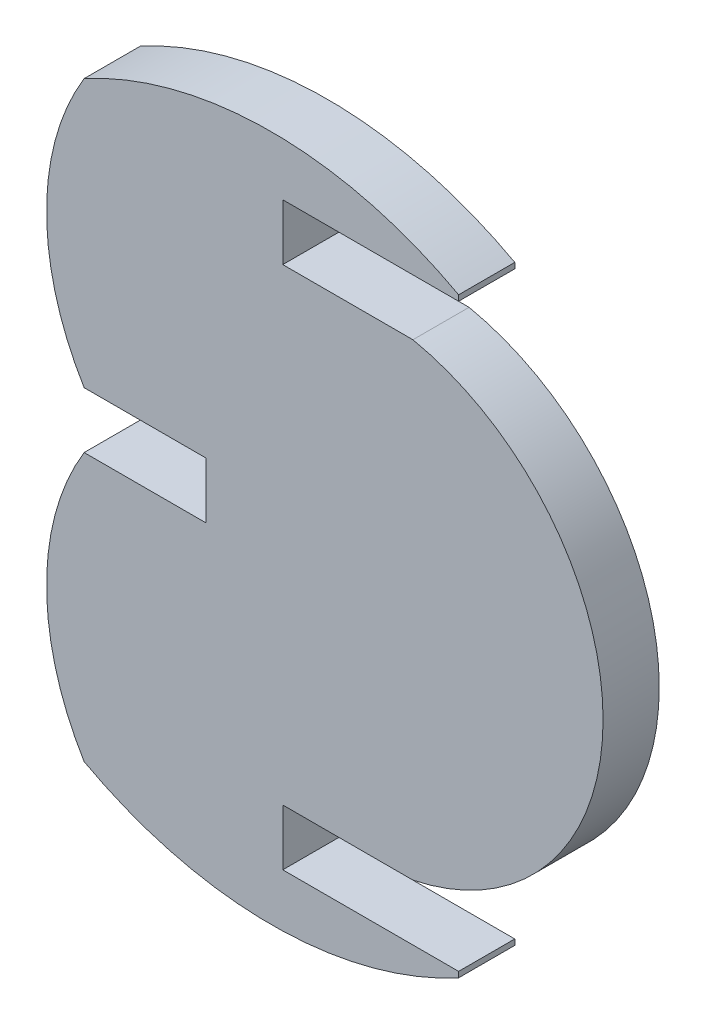
ISO-10303-21;
HEADER;
FILE_DESCRIPTION(('STEP AP214'),'2;1');
FILE_NAME('part.step','',(''),(''),'','','');
FILE_SCHEMA(('AUTOMOTIVE_DESIGN { 1 0 10303 214 1 1 1 1 }'));
ENDSEC;
DATA;
#1=APPLICATION_CONTEXT('core data for automotive mechanical design processes');
#2=APPLICATION_PROTOCOL_DEFINITION('international standard','automotive_design',2000,#1);
#3=PRODUCT_CONTEXT('',#1,'mechanical');
#4=PRODUCT('Part','Part','',(#3));
#5=PRODUCT_RELATED_PRODUCT_CATEGORY('part','',(#4));
#6=PRODUCT_DEFINITION_FORMATION('','',#4);
#7=PRODUCT_DEFINITION_CONTEXT('part definition',#1,'design');
#8=PRODUCT_DEFINITION('design','',#6,#7);
#9=PRODUCT_DEFINITION_SHAPE('','',#8);
#10=(LENGTH_UNIT() NAMED_UNIT(*) SI_UNIT(.MILLI.,.METRE.));
#11=(NAMED_UNIT(*) PLANE_ANGLE_UNIT() SI_UNIT($,.RADIAN.));
#12=(NAMED_UNIT(*) SI_UNIT($,.STERADIAN.) SOLID_ANGLE_UNIT());
#13=UNCERTAINTY_MEASURE_WITH_UNIT(LENGTH_MEASURE(1.E-05),#10,'distance_accuracy_value','');
#14=(GEOMETRIC_REPRESENTATION_CONTEXT(3) GLOBAL_UNCERTAINTY_ASSIGNED_CONTEXT((#13)) GLOBAL_UNIT_ASSIGNED_CONTEXT((#10,
#11,#12)) REPRESENTATION_CONTEXT('',''));
#15=CARTESIAN_POINT('',(0.,0.,0.));
#16=DIRECTION('',(0.,0.,1.));
#17=DIRECTION('',(1.,0.,0.));
#18=AXIS2_PLACEMENT_3D('',#15,#16,#17);
#19=CARTESIAN_POINT('',(-1351.67444337138,32.5978774634032,3.));
#20=DIRECTION('',(0.,0.,-1.));
#21=DIRECTION('',(-1.,0.,0.));
#22=AXIS2_PLACEMENT_3D('',#19,#20,#21);
#23=CYLINDRICAL_SURFACE('',#22,20.9391524518943);
#24=CARTESIAN_POINT('',(-1351.67444337138,32.5978774634033,0.));
#25=DIRECTION('',(0.,0.,1.));
#26=DIRECTION('',(-1.,0.,0.));
#27=AXIS2_PLACEMENT_3D('',#24,#25,#26);
#28=CIRCLE('',#27,20.9391524518943);
#29=CARTESIAN_POINT('',(-1341.67214431126,50.993586716262,0.));
#30=VERTEX_POINT('',#29);
#31=CARTESIAN_POINT('',(-1361.67674243149,50.9935867162619,1.11022302462516E-13));
#32=VERTEX_POINT('',#31);
#33=EDGE_CURVE('E148',#30,#32,#28,.T.);
#34=ORIENTED_EDGE('',*,*,#33,.T.);
#35=DIRECTION('',(0.,0.,-1.));
#36=VECTOR('',#35,1.);
#37=CARTESIAN_POINT('',(-1361.67674243149,50.9935867162619,3.00000000000003));
#38=LINE('',#37,#36);
#39=CARTESIAN_POINT('',(-1361.67674243149,50.9935867162619,3.00000000000003));
#40=VERTEX_POINT('',#39);
#41=EDGE_CURVE('E11',#40,#32,#38,.T.);
#42=ORIENTED_EDGE('',*,*,#41,.F.);
#43=CARTESIAN_POINT('',(-1351.67444337138,32.5978774634032,3.));
#44=DIRECTION('',(0.,0.,1.));
#45=DIRECTION('',(-1.,0.,0.));
#46=AXIS2_PLACEMENT_3D('',#43,#44,#45);
#47=CIRCLE('',#46,20.9391524518943);
#48=CARTESIAN_POINT('',(-1341.67214431126,50.9935867162618,2.99999999999989));
#49=VERTEX_POINT('',#48);
#50=EDGE_CURVE('E191',#49,#40,#47,.T.);
#51=ORIENTED_EDGE('',*,*,#50,.F.);
#52=DIRECTION('',(0.,0.,-1.));
#53=VECTOR('',#52,1.);
#54=CARTESIAN_POINT('',(-1341.67214431126,50.9935867162618,2.99999999999989));
#55=LINE('',#54,#53);
#56=EDGE_CURVE('E161',#49,#30,#55,.T.);
#57=ORIENTED_EDGE('',*,*,#56,.T.);
#58=EDGE_LOOP('',(#34,#42,#51,#57));
#59=FACE_BOUND('',#58,.T.);
#60=ADVANCED_FACE('F32',(#59),#23,.T.);
#61=CARTESIAN_POINT('',(-1349.93719267488,43.8432149049641,3.00000000000017));
#62=DIRECTION('',(0.,0.,-1.));
#63=DIRECTION('',(-1.,0.,0.));
#64=AXIS2_PLACEMENT_3D('',#61,#62,#63);
#65=CYLINDRICAL_SURFACE('',#64,13.7457209897385);
#66=CARTESIAN_POINT('',(-1349.93719267488,43.8432149049641,1.66533453693773E-13));
#67=DIRECTION('',(0.,0.,1.));
#68=DIRECTION('',(1.,0.,0.));
#69=AXIS2_PLACEMENT_3D('',#66,#67,#68);
#70=CIRCLE('',#69,13.7457209897385);
#71=CARTESIAN_POINT('',(-1361.67674243149,36.6928430936662,0.));
#72=VERTEX_POINT('',#71);
#73=EDGE_CURVE('E144',#32,#72,#70,.T.);
#74=ORIENTED_EDGE('',*,*,#73,.T.);
#75=DIRECTION('',(0.,0.,-1.));
#76=VECTOR('',#75,1.);
#77=CARTESIAN_POINT('',(-1361.67674243149,36.6928430936663,3.00000000000006));
#78=LINE('',#77,#76);
#79=CARTESIAN_POINT('',(-1361.67674243149,36.6928430936663,3.00000000000006));
#80=VERTEX_POINT('',#79);
#81=EDGE_CURVE('E39',#80,#72,#78,.T.);
#82=ORIENTED_EDGE('',*,*,#81,.F.);
#83=CARTESIAN_POINT('',(-1349.93719267488,43.8432149049641,3.00000000000017));
#84=DIRECTION('',(0.,0.,1.));
#85=DIRECTION('',(1.,0.,0.));
#86=AXIS2_PLACEMENT_3D('',#83,#84,#85);
#87=CIRCLE('',#86,13.7457209897385);
#88=EDGE_CURVE('E157',#40,#80,#87,.T.);
#89=ORIENTED_EDGE('',*,*,#88,.F.);
#90=ORIENTED_EDGE('',*,*,#41,.T.);
#91=EDGE_LOOP('',(#74,#82,#89,#90));
#92=FACE_BOUND('',#91,.T.);
#93=ADVANCED_FACE('F156',(#92),#65,.T.);
#94=CARTESIAN_POINT('',(-1361.67674243149,36.6928430936663,3.00000000000006));
#95=DIRECTION('',(0.,1.,0.));
#96=DIRECTION('',(-1.,0.,0.));
#97=AXIS2_PLACEMENT_3D('',#94,#95,#96);
#98=PLANE('',#97);
#99=DIRECTION('',(1.,0.,0.));
#100=VECTOR('',#99,1.);
#101=CARTESIAN_POINT('',(-1361.67674243149,36.6928430936662,0.));
#102=LINE('',#101,#100);
#103=CARTESIAN_POINT('',(-1355.15711139407,36.6928430936663,0.));
#104=VERTEX_POINT('',#103);
#105=EDGE_CURVE('E150',#72,#104,#102,.T.);
#106=ORIENTED_EDGE('',*,*,#105,.T.);
#107=DIRECTION('',(0.,0.,-1.));
#108=VECTOR('',#107,1.);
#109=CARTESIAN_POINT('',(-1355.15711139407,36.6928430936664,3.00000000000003));
#110=LINE('',#109,#108);
#111=CARTESIAN_POINT('',(-1355.15711139407,36.6928430936664,3.00000000000003));
#112=VERTEX_POINT('',#111);
#113=EDGE_CURVE('E257',#112,#104,#110,.T.);
#114=ORIENTED_EDGE('',*,*,#113,.F.);
#115=DIRECTION('',(1.,0.,0.));
#116=VECTOR('',#115,1.);
#117=CARTESIAN_POINT('',(-1361.67674243149,36.6928430936663,3.00000000000006));
#118=LINE('',#117,#116);
#119=EDGE_CURVE('E194',#80,#112,#118,.T.);
#120=ORIENTED_EDGE('',*,*,#119,.F.);
#121=ORIENTED_EDGE('',*,*,#81,.T.);
#122=EDGE_LOOP('',(#106,#114,#120,#121));
#123=FACE_BOUND('',#122,.T.);
#124=ADVANCED_FACE('F261',(#123),#98,.F.);
#125=CARTESIAN_POINT('',(-1355.15711139407,33.6928430936663,2.99999999999998));
#126=DIRECTION('',(1.,0.,0.));
#127=DIRECTION('',(0.,0.,-1.));
#128=AXIS2_PLACEMENT_3D('',#125,#126,#127);
#129=PLANE('',#128);
#130=DIRECTION('',(0.,-1.,0.));
#131=VECTOR('',#130,1.);
#132=CARTESIAN_POINT('',(-1355.15711139407,33.6928430936663,0.));
#133=LINE('',#132,#131);
#134=CARTESIAN_POINT('',(-1355.15711139407,33.6928430936663,0.));
#135=VERTEX_POINT('',#134);
#136=EDGE_CURVE('E165',#104,#135,#133,.T.);
#137=ORIENTED_EDGE('',*,*,#136,.T.);
#138=DIRECTION('',(0.,0.,-1.));
#139=VECTOR('',#138,1.);
#140=CARTESIAN_POINT('',(-1355.15711139407,33.6928430936663,2.99999999999998));
#141=LINE('',#140,#139);
#142=CARTESIAN_POINT('',(-1355.15711139407,33.6928430936663,2.99999999999998));
#143=VERTEX_POINT('',#142);
#144=EDGE_CURVE('E254',#143,#135,#141,.T.);
#145=ORIENTED_EDGE('',*,*,#144,.F.);
#146=DIRECTION('',(0.,-1.,0.));
#147=VECTOR('',#146,1.);
#148=CARTESIAN_POINT('',(-1355.15711139407,33.6928430936663,2.99999999999998));
#149=LINE('',#148,#147);
#150=EDGE_CURVE('E196',#112,#143,#149,.T.);
#151=ORIENTED_EDGE('',*,*,#150,.F.);
#152=ORIENTED_EDGE('',*,*,#113,.T.);
#153=EDGE_LOOP('',(#137,#145,#151,#152));
#154=FACE_BOUND('',#153,.T.);
#155=ADVANCED_FACE('F269',(#154),#129,.F.);
#156=CARTESIAN_POINT('',(-1361.67674243149,33.6928430936663,3.00000000000003));
#157=DIRECTION('',(0.,-1.,0.));
#158=DIRECTION('',(1.,0.,0.));
#159=AXIS2_PLACEMENT_3D('',#156,#157,#158);
#160=PLANE('',#159);
#161=DIRECTION('',(-1.,0.,0.));
#162=VECTOR('',#161,1.);
#163=CARTESIAN_POINT('',(-1361.67674243149,33.6928430936663,0.));
#164=LINE('',#163,#162);
#165=CARTESIAN_POINT('',(-1361.67674243149,33.6928430936663,0.));
#166=VERTEX_POINT('',#165);
#167=EDGE_CURVE('E167',#135,#166,#164,.T.);
#168=ORIENTED_EDGE('',*,*,#167,.T.);
#169=DIRECTION('',(0.,0.,-1.));
#170=VECTOR('',#169,1.);
#171=CARTESIAN_POINT('',(-1361.67674243149,33.6928430936663,3.00000000000003));
#172=LINE('',#171,#170);
#173=CARTESIAN_POINT('',(-1361.67674243149,33.6928430936663,3.00000000000003));
#174=VERTEX_POINT('',#173);
#175=EDGE_CURVE('E251',#174,#166,#172,.T.);
#176=ORIENTED_EDGE('',*,*,#175,.F.);
#177=DIRECTION('',(-1.,0.,0.));
#178=VECTOR('',#177,1.);
#179=CARTESIAN_POINT('',(-1361.67674243149,33.6928430936663,3.00000000000003));
#180=LINE('',#179,#178);
#181=EDGE_CURVE('E198',#143,#174,#180,.T.);
#182=ORIENTED_EDGE('',*,*,#181,.F.);
#183=ORIENTED_EDGE('',*,*,#144,.T.);
#184=EDGE_LOOP('',(#168,#176,#182,#183));
#185=FACE_BOUND('',#184,.T.);
#186=ADVANCED_FACE('F272',(#185),#160,.F.);
#187=CARTESIAN_POINT('',(-1349.93719267488,26.5424712823685,2.99999999999996));
#188=DIRECTION('',(0.,0.,-1.));
#189=DIRECTION('',(-1.,0.,0.));
#190=AXIS2_PLACEMENT_3D('',#187,#188,#189);
#191=CYLINDRICAL_SURFACE('',#190,13.7457209897385);
#192=CARTESIAN_POINT('',(-1349.93719267488,26.5424712823684,0.));
#193=DIRECTION('',(0.,0.,1.));
#194=DIRECTION('',(-1.,0.,0.));
#195=AXIS2_PLACEMENT_3D('',#192,#193,#194);
#196=CIRCLE('',#195,13.7457209897385);
#197=CARTESIAN_POINT('',(-1361.67674243149,19.3920994710707,0.));
#198=VERTEX_POINT('',#197);
#199=EDGE_CURVE('E169',#166,#198,#196,.T.);
#200=ORIENTED_EDGE('',*,*,#199,.T.);
#201=DIRECTION('',(0.,0.,-1.));
#202=VECTOR('',#201,1.);
#203=CARTESIAN_POINT('',(-1361.67674243149,19.3920994710706,2.99999999999996));
#204=LINE('',#203,#202);
#205=CARTESIAN_POINT('',(-1361.67674243149,19.3920994710706,2.99999999999996));
#206=VERTEX_POINT('',#205);
#207=EDGE_CURVE('E248',#206,#198,#204,.T.);
#208=ORIENTED_EDGE('',*,*,#207,.F.);
#209=CARTESIAN_POINT('',(-1349.93719267488,26.5424712823685,2.99999999999996));
#210=DIRECTION('',(0.,0.,1.));
#211=DIRECTION('',(-1.,0.,0.));
#212=AXIS2_PLACEMENT_3D('',#209,#210,#211);
#213=CIRCLE('',#212,13.7457209897385);
#214=EDGE_CURVE('E200',#174,#206,#213,.T.);
#215=ORIENTED_EDGE('',*,*,#214,.F.);
#216=ORIENTED_EDGE('',*,*,#175,.T.);
#217=EDGE_LOOP('',(#200,#208,#215,#216));
#218=FACE_BOUND('',#217,.T.);
#219=ADVANCED_FACE('F277',(#218),#191,.T.);
#220=CARTESIAN_POINT('',(-1351.67444337138,37.7878087239291,3.00000000000013));
#221=DIRECTION('',(0.,0.,-1.));
#222=DIRECTION('',(-1.,0.,0.));
#223=AXIS2_PLACEMENT_3D('',#220,#221,#222);
#224=CYLINDRICAL_SURFACE('',#223,20.9391524518943);
#225=CARTESIAN_POINT('',(-1351.67444337138,37.7878087239291,0.));
#226=DIRECTION('',(0.,0.,1.));
#227=DIRECTION('',(1.,0.,0.));
#228=AXIS2_PLACEMENT_3D('',#225,#226,#227);
#229=CIRCLE('',#228,20.9391524518943);
#230=CARTESIAN_POINT('',(-1341.67214431126,19.3920994710709,0.));
#231=VERTEX_POINT('',#230);
#232=EDGE_CURVE('E171',#198,#231,#229,.T.);
#233=ORIENTED_EDGE('',*,*,#232,.T.);
#234=DIRECTION('',(0.,0.,-1.));
#235=VECTOR('',#234,1.);
#236=CARTESIAN_POINT('',(-1341.67214431126,19.3920994710709,3.00000000000004));
#237=LINE('',#236,#235);
#238=CARTESIAN_POINT('',(-1341.67214431126,19.3920994710709,3.00000000000004));
#239=VERTEX_POINT('',#238);
#240=EDGE_CURVE('E245',#239,#231,#237,.T.);
#241=ORIENTED_EDGE('',*,*,#240,.F.);
#242=CARTESIAN_POINT('',(-1351.67444337138,37.7878087239291,3.00000000000013));
#243=DIRECTION('',(0.,0.,1.));
#244=DIRECTION('',(1.,0.,0.));
#245=AXIS2_PLACEMENT_3D('',#242,#243,#244);
#246=CIRCLE('',#245,20.9391524518943);
#247=EDGE_CURVE('E202',#206,#239,#246,.T.);
#248=ORIENTED_EDGE('',*,*,#247,.F.);
#249=ORIENTED_EDGE('',*,*,#207,.T.);
#250=EDGE_LOOP('',(#233,#241,#248,#249));
#251=FACE_BOUND('',#250,.T.);
#252=ADVANCED_FACE('F283',(#251),#224,.T.);
#253=CARTESIAN_POINT('',(-1341.67214431126,19.3920994710709,3.00000000000004));
#254=DIRECTION('',(-1.,0.,0.));
#255=DIRECTION('',(0.,0.,1.));
#256=AXIS2_PLACEMENT_3D('',#253,#254,#255);
#257=PLANE('',#256);
#258=DIRECTION('',(0.,1.,0.));
#259=VECTOR('',#258,1.);
#260=CARTESIAN_POINT('',(-1341.67214431126,19.3920994710709,0.));
#261=LINE('',#260,#259);
#262=CARTESIAN_POINT('',(-1341.67214431126,19.6928430936664,0.));
#263=VERTEX_POINT('',#262);
#264=EDGE_CURVE('E173',#231,#263,#261,.T.);
#265=ORIENTED_EDGE('',*,*,#264,.T.);
#266=DIRECTION('',(0.,0.,-1.));
#267=VECTOR('',#266,1.);
#268=CARTESIAN_POINT('',(-1341.67214431126,19.6928430936664,2.99999999999999));
#269=LINE('',#268,#267);
#270=CARTESIAN_POINT('',(-1341.67214431126,19.6928430936664,2.99999999999999));
#271=VERTEX_POINT('',#270);
#272=EDGE_CURVE('E242',#271,#263,#269,.T.);
#273=ORIENTED_EDGE('',*,*,#272,.F.);
#274=DIRECTION('',(0.,1.,0.));
#275=VECTOR('',#274,1.);
#276=CARTESIAN_POINT('',(-1341.67214431126,19.3920994710709,3.00000000000004));
#277=LINE('',#276,#275);
#278=EDGE_CURVE('E204',#239,#271,#277,.T.);
#279=ORIENTED_EDGE('',*,*,#278,.F.);
#280=ORIENTED_EDGE('',*,*,#240,.T.);
#281=EDGE_LOOP('',(#265,#273,#279,#280));
#282=FACE_BOUND('',#281,.T.);
#283=ADVANCED_FACE('F287',(#282),#257,.F.);
#284=CARTESIAN_POINT('',(-1351.06579288135,19.6928430936662,3.00000000000009));
#285=DIRECTION('',(0.,-1.,0.));
#286=DIRECTION('',(0.,0.,-1.));
#287=AXIS2_PLACEMENT_3D('',#284,#285,#286);
#288=PLANE('',#287);
#289=DIRECTION('',(-1.,0.,0.));
#290=VECTOR('',#289,1.);
#291=CARTESIAN_POINT('',(-1351.06579288135,19.6928430936663,0.));
#292=LINE('',#291,#290);
#293=CARTESIAN_POINT('',(-1351.06579288135,19.6928430936663,0.));
#294=VERTEX_POINT('',#293);
#295=EDGE_CURVE('E175',#263,#294,#292,.T.);
#296=ORIENTED_EDGE('',*,*,#295,.T.);
#297=DIRECTION('',(0.,0.,-1.));
#298=VECTOR('',#297,1.);
#299=CARTESIAN_POINT('',(-1351.06579288135,19.6928430936662,3.00000000000009));
#300=LINE('',#299,#298);
#301=CARTESIAN_POINT('',(-1351.06579288135,19.6928430936662,3.00000000000009));
#302=VERTEX_POINT('',#301);
#303=EDGE_CURVE('E239',#302,#294,#300,.T.);
#304=ORIENTED_EDGE('',*,*,#303,.F.);
#305=DIRECTION('',(-1.,0.,0.));
#306=VECTOR('',#305,1.);
#307=CARTESIAN_POINT('',(-1351.06579288135,19.6928430936662,3.00000000000009));
#308=LINE('',#307,#306);
#309=EDGE_CURVE('E206',#271,#302,#308,.T.);
#310=ORIENTED_EDGE('',*,*,#309,.F.);
#311=ORIENTED_EDGE('',*,*,#272,.T.);
#312=EDGE_LOOP('',(#296,#304,#310,#311));
#313=FACE_BOUND('',#312,.T.);
#314=ADVANCED_FACE('F292',(#313),#288,.F.);
#315=CARTESIAN_POINT('',(-1351.06579288135,19.6928430936662,3.00000000000009));
#316=DIRECTION('',(-1.,0.,0.));
#317=DIRECTION('',(0.,0.,1.));
#318=AXIS2_PLACEMENT_3D('',#315,#316,#317);
#319=PLANE('',#318);
#320=DIRECTION('',(0.,1.,0.));
#321=VECTOR('',#320,1.);
#322=CARTESIAN_POINT('',(-1351.06579288135,19.6928430936663,0.));
#323=LINE('',#322,#321);
#324=CARTESIAN_POINT('',(-1351.06579288135,22.6928430936663,0.));
#325=VERTEX_POINT('',#324);
#326=EDGE_CURVE('E177',#294,#325,#323,.T.);
#327=ORIENTED_EDGE('',*,*,#326,.T.);
#328=DIRECTION('',(0.,0.,-1.));
#329=VECTOR('',#328,1.);
#330=CARTESIAN_POINT('',(-1351.06579288135,22.6928430936664,3.00000000000006));
#331=LINE('',#330,#329);
#332=CARTESIAN_POINT('',(-1351.06579288135,22.6928430936664,3.00000000000006));
#333=VERTEX_POINT('',#332);
#334=EDGE_CURVE('E236',#333,#325,#331,.T.);
#335=ORIENTED_EDGE('',*,*,#334,.F.);
#336=DIRECTION('',(0.,1.,0.));
#337=VECTOR('',#336,1.);
#338=CARTESIAN_POINT('',(-1351.06579288135,19.6928430936662,3.00000000000009));
#339=LINE('',#338,#337);
#340=EDGE_CURVE('E208',#302,#333,#339,.T.);
#341=ORIENTED_EDGE('',*,*,#340,.F.);
#342=ORIENTED_EDGE('',*,*,#303,.T.);
#343=EDGE_LOOP('',(#327,#335,#341,#342));
#344=FACE_BOUND('',#343,.T.);
#345=ADVANCED_FACE('F298',(#344),#319,.F.);
#346=CARTESIAN_POINT('',(-1351.06579288135,22.6928430936664,3.00000000000006));
#347=DIRECTION('',(0.,1.,0.));
#348=DIRECTION('',(0.,0.,1.));
#349=AXIS2_PLACEMENT_3D('',#346,#347,#348);
#350=PLANE('',#349);
#351=DIRECTION('',(1.,0.,0.));
#352=VECTOR('',#351,1.);
#353=CARTESIAN_POINT('',(-1351.06579288135,22.6928430936663,0.));
#354=LINE('',#353,#352);
#355=CARTESIAN_POINT('',(-1344.11344595067,22.6928430936663,0.));
#356=VERTEX_POINT('',#355);
#357=EDGE_CURVE('E179',#325,#356,#354,.T.);
#358=ORIENTED_EDGE('',*,*,#357,.T.);
#359=DIRECTION('',(0.,0.,-1.));
#360=VECTOR('',#359,1.);
#361=CARTESIAN_POINT('',(-1344.11344595067,22.6928430936664,3.0000000000002));
#362=LINE('',#361,#360);
#363=CARTESIAN_POINT('',(-1344.11344595067,22.6928430936664,3.0000000000002));
#364=VERTEX_POINT('',#363);
#365=EDGE_CURVE('E233',#364,#356,#362,.T.);
#366=ORIENTED_EDGE('',*,*,#365,.F.);
#367=DIRECTION('',(1.,0.,0.));
#368=VECTOR('',#367,1.);
#369=CARTESIAN_POINT('',(-1351.06579288135,22.6928430936664,3.00000000000006));
#370=LINE('',#369,#368);
#371=EDGE_CURVE('E210',#333,#364,#370,.T.);
#372=ORIENTED_EDGE('',*,*,#371,.F.);
#373=ORIENTED_EDGE('',*,*,#334,.T.);
#374=EDGE_LOOP('',(#358,#366,#372,#373));
#375=FACE_BOUND('',#374,.T.);
#376=ADVANCED_FACE('F302',(#375),#350,.F.);
#377=CARTESIAN_POINT('',(-1346.72424414561,35.1928430936662,3.));
#378=DIRECTION('',(0.,0.,-1.));
#379=DIRECTION('',(-1.,0.,0.));
#380=AXIS2_PLACEMENT_3D('',#377,#378,#379);
#381=CYLINDRICAL_SURFACE('',#380,12.7697402955071);
#382=CARTESIAN_POINT('',(-1346.72424414561,35.1928430936662,0.));
#383=DIRECTION('',(0.,0.,1.));
#384=DIRECTION('',(-1.,0.,0.));
#385=AXIS2_PLACEMENT_3D('',#382,#383,#384);
#386=CIRCLE('',#385,12.7697402955071);
#387=CARTESIAN_POINT('',(-1344.11344595067,47.6928430936665,2.22044604925031E-13));
#388=VERTEX_POINT('',#387);
#389=EDGE_CURVE('E181',#356,#388,#386,.T.);
#390=ORIENTED_EDGE('',*,*,#389,.T.);
#391=DIRECTION('',(0.,0.,-1.));
#392=VECTOR('',#391,1.);
#393=CARTESIAN_POINT('',(-1344.11344595067,47.6928430936662,2.99999999999985));
#394=LINE('',#393,#392);
#395=CARTESIAN_POINT('',(-1344.11344595067,47.6928430936662,2.99999999999985));
#396=VERTEX_POINT('',#395);
#397=EDGE_CURVE('E230',#396,#388,#394,.T.);
#398=ORIENTED_EDGE('',*,*,#397,.F.);
#399=CARTESIAN_POINT('',(-1346.72424414561,35.1928430936662,3.));
#400=DIRECTION('',(0.,0.,1.));
#401=DIRECTION('',(-1.,0.,0.));
#402=AXIS2_PLACEMENT_3D('',#399,#400,#401);
#403=CIRCLE('',#402,12.7697402955071);
#404=EDGE_CURVE('E212',#364,#396,#403,.T.);
#405=ORIENTED_EDGE('',*,*,#404,.F.);
#406=ORIENTED_EDGE('',*,*,#365,.T.);
#407=EDGE_LOOP('',(#390,#398,#405,#406));
#408=FACE_BOUND('',#407,.T.);
#409=ADVANCED_FACE('F307',(#408),#381,.T.);
#410=CARTESIAN_POINT('',(-1351.06579288135,47.6928430936662,2.99999999999992));
#411=DIRECTION('',(0.,-1.,0.));
#412=DIRECTION('',(0.,0.,-1.));
#413=AXIS2_PLACEMENT_3D('',#410,#411,#412);
#414=PLANE('',#413);
#415=DIRECTION('',(-1.,0.,0.));
#416=VECTOR('',#415,1.);
#417=CARTESIAN_POINT('',(-1351.06579288135,47.6928430936663,1.52655665885959E-13));
#418=LINE('',#417,#416);
#419=CARTESIAN_POINT('',(-1351.06579288135,47.6928430936663,1.52655665885959E-13));
#420=VERTEX_POINT('',#419);
#421=EDGE_CURVE('E183',#388,#420,#418,.T.);
#422=ORIENTED_EDGE('',*,*,#421,.T.);
#423=DIRECTION('',(0.,0.,-1.));
#424=VECTOR('',#423,1.);
#425=CARTESIAN_POINT('',(-1351.06579288135,47.6928430936662,2.99999999999992));
#426=LINE('',#425,#424);
#427=CARTESIAN_POINT('',(-1351.06579288135,47.6928430936662,2.99999999999992));
#428=VERTEX_POINT('',#427);
#429=EDGE_CURVE('E227',#428,#420,#426,.T.);
#430=ORIENTED_EDGE('',*,*,#429,.F.);
#431=DIRECTION('',(-1.,0.,0.));
#432=VECTOR('',#431,1.);
#433=CARTESIAN_POINT('',(-1351.06579288135,47.6928430936662,2.99999999999992));
#434=LINE('',#433,#432);
#435=EDGE_CURVE('E214',#396,#428,#434,.T.);
#436=ORIENTED_EDGE('',*,*,#435,.F.);
#437=ORIENTED_EDGE('',*,*,#397,.T.);
#438=EDGE_LOOP('',(#422,#430,#436,#437));
#439=FACE_BOUND('',#438,.T.);
#440=ADVANCED_FACE('F313',(#439),#414,.F.);
#441=CARTESIAN_POINT('',(-1351.06579288135,50.6928430936662,2.99999999999996));
#442=DIRECTION('',(-1.,0.,0.));
#443=DIRECTION('',(0.,0.,1.));
#444=AXIS2_PLACEMENT_3D('',#441,#442,#443);
#445=PLANE('',#444);
#446=DIRECTION('',(0.,1.,0.));
#447=VECTOR('',#446,1.);
#448=CARTESIAN_POINT('',(-1351.06579288135,50.6928430936662,0.));
#449=LINE('',#448,#447);
#450=CARTESIAN_POINT('',(-1351.06579288135,50.6928430936662,0.));
#451=VERTEX_POINT('',#450);
#452=EDGE_CURVE('E185',#420,#451,#449,.T.);
#453=ORIENTED_EDGE('',*,*,#452,.T.);
#454=DIRECTION('',(0.,0.,-1.));
#455=VECTOR('',#454,1.);
#456=CARTESIAN_POINT('',(-1351.06579288135,50.6928430936662,2.99999999999996));
#457=LINE('',#456,#455);
#458=CARTESIAN_POINT('',(-1351.06579288135,50.6928430936662,2.99999999999996));
#459=VERTEX_POINT('',#458);
#460=EDGE_CURVE('E224',#459,#451,#457,.T.);
#461=ORIENTED_EDGE('',*,*,#460,.F.);
#462=DIRECTION('',(0.,1.,0.));
#463=VECTOR('',#462,1.);
#464=CARTESIAN_POINT('',(-1351.06579288135,50.6928430936662,2.99999999999996));
#465=LINE('',#464,#463);
#466=EDGE_CURVE('E216',#428,#459,#465,.T.);
#467=ORIENTED_EDGE('',*,*,#466,.F.);
#468=ORIENTED_EDGE('',*,*,#429,.T.);
#469=EDGE_LOOP('',(#453,#461,#467,#468));
#470=FACE_BOUND('',#469,.T.);
#471=ADVANCED_FACE('F317',(#470),#445,.F.);
#472=CARTESIAN_POINT('',(-1351.06579288135,50.6928430936662,2.99999999999996));
#473=DIRECTION('',(0.,1.,0.));
#474=DIRECTION('',(0.,0.,1.));
#475=AXIS2_PLACEMENT_3D('',#472,#473,#474);
#476=PLANE('',#475);
#477=DIRECTION('',(1.,0.,0.));
#478=VECTOR('',#477,1.);
#479=CARTESIAN_POINT('',(-1351.06579288135,50.6928430936662,0.));
#480=LINE('',#479,#478);
#481=CARTESIAN_POINT('',(-1341.67214431126,50.6928430936662,0.));
#482=VERTEX_POINT('',#481);
#483=EDGE_CURVE('E187',#451,#482,#480,.T.);
#484=ORIENTED_EDGE('',*,*,#483,.T.);
#485=DIRECTION('',(0.,0.,-1.));
#486=VECTOR('',#485,1.);
#487=CARTESIAN_POINT('',(-1341.67214431126,50.6928430936663,2.99999999999995));
#488=LINE('',#487,#486);
#489=CARTESIAN_POINT('',(-1341.67214431126,50.6928430936663,2.99999999999995));
#490=VERTEX_POINT('',#489);
#491=EDGE_CURVE('E221',#490,#482,#488,.T.);
#492=ORIENTED_EDGE('',*,*,#491,.F.);
#493=DIRECTION('',(1.,0.,0.));
#494=VECTOR('',#493,1.);
#495=CARTESIAN_POINT('',(-1351.06579288135,50.6928430936662,2.99999999999996));
#496=LINE('',#495,#494);
#497=EDGE_CURVE('E51',#459,#490,#496,.T.);
#498=ORIENTED_EDGE('',*,*,#497,.F.);
#499=ORIENTED_EDGE('',*,*,#460,.T.);
#500=EDGE_LOOP('',(#484,#492,#498,#499));
#501=FACE_BOUND('',#500,.T.);
#502=ADVANCED_FACE('F320',(#501),#476,.F.);
#503=CARTESIAN_POINT('',(-1341.67214431126,50.9935867162618,2.99999999999989));
#504=DIRECTION('',(-1.,0.,0.));
#505=DIRECTION('',(0.,0.,1.));
#506=AXIS2_PLACEMENT_3D('',#503,#504,#505);
#507=PLANE('',#506);
#508=DIRECTION('',(0.,1.,0.));
#509=VECTOR('',#508,1.);
#510=CARTESIAN_POINT('',(-1341.67214431126,50.993586716262,0.));
#511=LINE('',#510,#509);
#512=EDGE_CURVE('E189',#482,#30,#511,.T.);
#513=ORIENTED_EDGE('',*,*,#512,.T.);
#514=ORIENTED_EDGE('',*,*,#56,.F.);
#515=DIRECTION('',(0.,1.,0.));
#516=VECTOR('',#515,1.);
#517=CARTESIAN_POINT('',(-1341.67214431126,50.9935867162618,2.99999999999989));
#518=LINE('',#517,#516);
#519=EDGE_CURVE('E46',#490,#49,#518,.T.);
#520=ORIENTED_EDGE('',*,*,#519,.F.);
#521=ORIENTED_EDGE('',*,*,#491,.T.);
#522=EDGE_LOOP('',(#513,#514,#520,#521));
#523=FACE_BOUND('',#522,.T.);
#524=ADVANCED_FACE('F322',(#523),#507,.F.);
#525=CARTESIAN_POINT('',(-1351.67444337138,32.5978774634032,3.));
#526=DIRECTION('',(0.,0.,-1.));
#527=DIRECTION('',(-1.,0.,0.));
#528=AXIS2_PLACEMENT_3D('',#525,#526,#527);
#529=PLANE('',#528);
#530=ORIENTED_EDGE('',*,*,#50,.T.);
#531=ORIENTED_EDGE('',*,*,#88,.T.);
#532=ORIENTED_EDGE('',*,*,#119,.T.);
#533=ORIENTED_EDGE('',*,*,#150,.T.);
#534=ORIENTED_EDGE('',*,*,#181,.T.);
#535=ORIENTED_EDGE('',*,*,#214,.T.);
#536=ORIENTED_EDGE('',*,*,#247,.T.);
#537=ORIENTED_EDGE('',*,*,#278,.T.);
#538=ORIENTED_EDGE('',*,*,#309,.T.);
#539=ORIENTED_EDGE('',*,*,#340,.T.);
#540=ORIENTED_EDGE('',*,*,#371,.T.);
#541=ORIENTED_EDGE('',*,*,#404,.T.);
#542=ORIENTED_EDGE('',*,*,#435,.T.);
#543=ORIENTED_EDGE('',*,*,#466,.T.);
#544=ORIENTED_EDGE('',*,*,#497,.T.);
#545=ORIENTED_EDGE('',*,*,#519,.T.);
#546=EDGE_LOOP('',(#530,#531,#532,#533,#534,#535,#536,#537,#538,#539,#540,#541,#542,#543,#544,#545));
#547=FACE_BOUND('',#546,.T.);
#548=ADVANCED_FACE('F264',(#547),#529,.F.);
#549=CARTESIAN_POINT('',(-1351.67444337138,32.5978774634033,0.));
#550=DIRECTION('',(0.,0.,-1.));
#551=DIRECTION('',(-1.,0.,0.));
#552=AXIS2_PLACEMENT_3D('',#549,#550,#551);
#553=PLANE('',#552);
#554=ORIENTED_EDGE('',*,*,#33,.F.);
#555=ORIENTED_EDGE('',*,*,#512,.F.);
#556=ORIENTED_EDGE('',*,*,#483,.F.);
#557=ORIENTED_EDGE('',*,*,#452,.F.);
#558=ORIENTED_EDGE('',*,*,#421,.F.);
#559=ORIENTED_EDGE('',*,*,#389,.F.);
#560=ORIENTED_EDGE('',*,*,#357,.F.);
#561=ORIENTED_EDGE('',*,*,#326,.F.);
#562=ORIENTED_EDGE('',*,*,#295,.F.);
#563=ORIENTED_EDGE('',*,*,#264,.F.);
#564=ORIENTED_EDGE('',*,*,#232,.F.);
#565=ORIENTED_EDGE('',*,*,#199,.F.);
#566=ORIENTED_EDGE('',*,*,#167,.F.);
#567=ORIENTED_EDGE('',*,*,#136,.F.);
#568=ORIENTED_EDGE('',*,*,#105,.F.);
#569=ORIENTED_EDGE('',*,*,#73,.F.);
#570=EDGE_LOOP('',(#554,#555,#556,#557,#558,#559,#560,#561,#562,#563,#564,#565,#566,#567,#568,#569));
#571=FACE_BOUND('',#570,.T.);
#572=ADVANCED_FACE('F145',(#571),#553,.T.);
#573=CLOSED_SHELL('',(#60,#93,#124,#155,#186,#219,#252,#283,#314,#345,#376,#409,#440,#471,#502,
#524,#548,#572));
#574=MANIFOLD_SOLID_BREP('B2',#573);
#575=ADVANCED_BREP_SHAPE_REPRESENTATION('',(#18,#574),#14);
#576=SHAPE_DEFINITION_REPRESENTATION(#9,#575);
ENDSEC;
END-ISO-10303-21;
